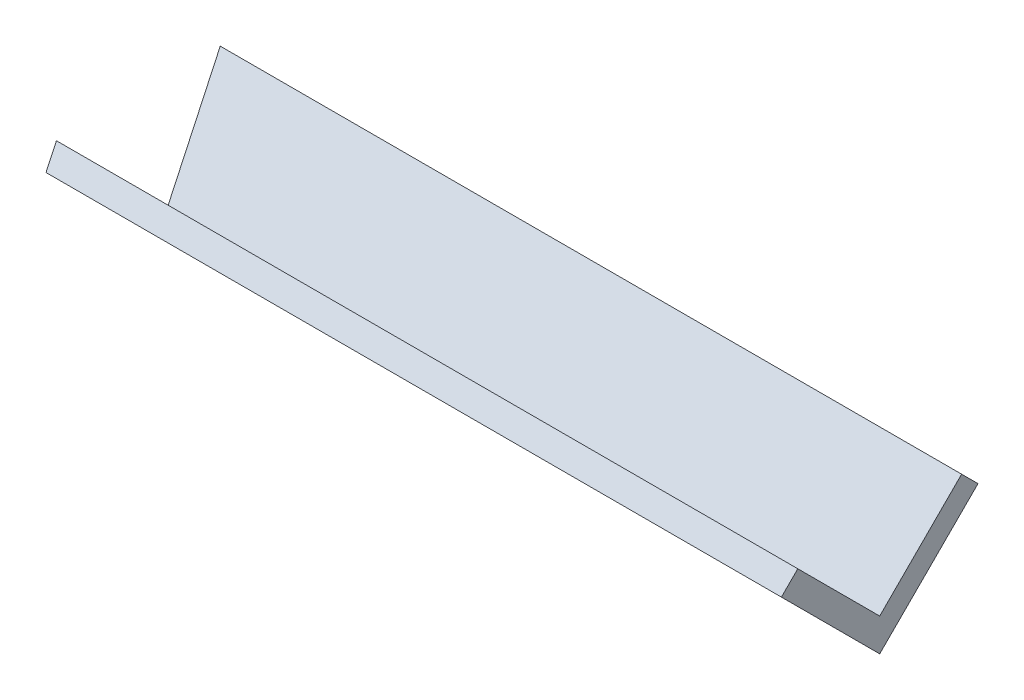
ISO-10303-21;
HEADER;
FILE_DESCRIPTION(('STEP AP214'),'2;1');
FILE_NAME('part.step','',(''),(''),'','','');
FILE_SCHEMA(('AUTOMOTIVE_DESIGN { 1 0 10303 214 1 1 1 1 }'));
ENDSEC;
DATA;
#1=APPLICATION_CONTEXT('core data for automotive mechanical design processes');
#2=APPLICATION_PROTOCOL_DEFINITION('international standard','automotive_design',2000,#1);
#3=PRODUCT_CONTEXT('',#1,'mechanical');
#4=PRODUCT('Part','Part','',(#3));
#5=PRODUCT_RELATED_PRODUCT_CATEGORY('part','',(#4));
#6=PRODUCT_DEFINITION_FORMATION('','',#4);
#7=PRODUCT_DEFINITION_CONTEXT('part definition',#1,'design');
#8=PRODUCT_DEFINITION('design','',#6,#7);
#9=PRODUCT_DEFINITION_SHAPE('','',#8);
#10=(LENGTH_UNIT() NAMED_UNIT(*) SI_UNIT(.MILLI.,.METRE.));
#11=(NAMED_UNIT(*) PLANE_ANGLE_UNIT() SI_UNIT($,.RADIAN.));
#12=(NAMED_UNIT(*) SI_UNIT($,.STERADIAN.) SOLID_ANGLE_UNIT());
#13=UNCERTAINTY_MEASURE_WITH_UNIT(LENGTH_MEASURE(1.E-05),#10,'distance_accuracy_value','');
#14=(GEOMETRIC_REPRESENTATION_CONTEXT(3) GLOBAL_UNCERTAINTY_ASSIGNED_CONTEXT((#13)) GLOBAL_UNIT_ASSIGNED_CONTEXT((#10,
#11,#12)) REPRESENTATION_CONTEXT('',''));
#15=CARTESIAN_POINT('',(0.,0.,0.));
#16=DIRECTION('',(0.,0.,1.));
#17=DIRECTION('',(1.,0.,0.));
#18=AXIS2_PLACEMENT_3D('',#15,#16,#17);
#19=CARTESIAN_POINT('',(101.6,13.4703841816037,-13.4703841816037));
#20=DIRECTION('',(0.,0.707106781186548,0.707106781186548));
#21=DIRECTION('',(0.,-0.707106781186548,0.707106781186548));
#22=AXIS2_PLACEMENT_3D('',#19,#20,#21);
#23=PLANE('',#22);
#24=DIRECTION('',(-1.,0.,0.));
#25=VECTOR('',#24,1.);
#26=CARTESIAN_POINT('',(101.6,0.,0.));
#27=LINE('',#26,#25);
#28=CARTESIAN_POINT('',(101.6,0.,0.));
#29=VERTEX_POINT('',#28);
#30=CARTESIAN_POINT('',(5.71995536727309,0.,0.));
#31=VERTEX_POINT('',#30);
#32=EDGE_CURVE('E102',#29,#31,#27,.T.);
#33=ORIENTED_EDGE('',*,*,#32,.T.);
#34=DIRECTION('',(-0.249243569363955,0.684791078771736,-0.684791078771736));
#35=VECTOR('',#34,1.);
#36=CARTESIAN_POINT('',(7.07800549487229,-3.73121206006632,3.73121206006632));
#37=LINE('',#36,#35);
#38=CARTESIAN_POINT('',(0.817136481039002,13.4703841816037,-13.4703841816037));
#39=VERTEX_POINT('',#38);
#40=EDGE_CURVE('E46',#31,#39,#37,.T.);
#41=ORIENTED_EDGE('',*,*,#40,.T.);
#42=DIRECTION('',(-1.,0.,0.));
#43=VECTOR('',#42,1.);
#44=CARTESIAN_POINT('',(101.6,13.4703841816037,-13.4703841816037));
#45=LINE('',#44,#43);
#46=CARTESIAN_POINT('',(101.6,13.4703841816037,-13.4703841816037));
#47=VERTEX_POINT('',#46);
#48=EDGE_CURVE('E11',#47,#39,#45,.T.);
#49=ORIENTED_EDGE('',*,*,#48,.F.);
#50=DIRECTION('',(0.,0.707106781186548,-0.707106781186548));
#51=VECTOR('',#50,1.);
#52=CARTESIAN_POINT('',(101.6,13.4703841816037,-13.4703841816037));
#53=LINE('',#52,#51);
#54=EDGE_CURVE('E126',#29,#47,#53,.T.);
#55=ORIENTED_EDGE('',*,*,#54,.F.);
#56=EDGE_LOOP('',(#33,#41,#49,#55));
#57=FACE_BOUND('',#56,.T.);
#58=ADVANCED_FACE('F32',(#57),#23,.F.);
#59=CARTESIAN_POINT('',(101.6,15.715448211871,-11.2253201513364));
#60=DIRECTION('',(0.,-0.707106781186547,0.707106781186548));
#61=DIRECTION('',(0.,-0.707106781186548,-0.707106781186547));
#62=AXIS2_PLACEMENT_3D('',#59,#60,#61);
#63=PLANE('',#62);
#64=ORIENTED_EDGE('',*,*,#48,.T.);
#65=DIRECTION('',(-0.249243569363955,0.684791078771736,0.684791078771735));
#66=VECTOR('',#65,1.);
#67=CARTESIAN_POINT('',(6.3116314579193,-1.62561669868172,-28.5663850618891));
#68=LINE('',#67,#66);
#69=CARTESIAN_POINT('',(0.,15.715448211871,-11.2253201513364));
#70=VERTEX_POINT('',#69);
#71=EDGE_CURVE('E123',#39,#70,#68,.T.);
#72=ORIENTED_EDGE('',*,*,#71,.T.);
#73=DIRECTION('',(-1.,0.,0.));
#74=VECTOR('',#73,1.);
#75=CARTESIAN_POINT('',(101.6,15.715448211871,-11.2253201513364));
#76=LINE('',#75,#74);
#77=CARTESIAN_POINT('',(101.6,15.715448211871,-11.2253201513364));
#78=VERTEX_POINT('',#77);
#79=EDGE_CURVE('E39',#78,#70,#76,.T.);
#80=ORIENTED_EDGE('',*,*,#79,.F.);
#81=DIRECTION('',(0.,0.707106781186548,0.707106781186547));
#82=VECTOR('',#81,1.);
#83=CARTESIAN_POINT('',(101.6,15.715448211871,-11.2253201513364));
#84=LINE('',#83,#82);
#85=EDGE_CURVE('E122',#47,#78,#84,.T.);
#86=ORIENTED_EDGE('',*,*,#85,.F.);
#87=EDGE_LOOP('',(#64,#72,#80,#86));
#88=FACE_BOUND('',#87,.T.);
#89=ADVANCED_FACE('F121',(#88),#63,.F.);
#90=CARTESIAN_POINT('',(101.6,4.49012806053458,0.));
#91=DIRECTION('',(0.,-0.707106781186547,-0.707106781186548));
#92=DIRECTION('',(0.,0.707106781186548,-0.707106781186547));
#93=AXIS2_PLACEMENT_3D('',#90,#91,#92);
#94=PLANE('',#93);
#95=ORIENTED_EDGE('',*,*,#79,.T.);
#96=DIRECTION('',(0.249243569363955,-0.684791078771736,0.684791078771736));
#97=VECTOR('',#96,1.);
#98=CARTESIAN_POINT('',(10.1435016426843,-12.1535935056048,16.6437215661394));
#99=LINE('',#98,#97);
#100=CARTESIAN_POINT('',(4.08568240519503,4.49012806053458,0.));
#101=VERTEX_POINT('',#100);
#102=EDGE_CURVE('E117',#70,#101,#99,.T.);
#103=ORIENTED_EDGE('',*,*,#102,.T.);
#104=DIRECTION('',(-1.,0.,0.));
#105=VECTOR('',#104,1.);
#106=CARTESIAN_POINT('',(101.6,4.49012806053458,0.));
#107=LINE('',#106,#105);
#108=CARTESIAN_POINT('',(101.6,4.49012806053458,0.));
#109=VERTEX_POINT('',#108);
#110=EDGE_CURVE('E104',#109,#101,#107,.T.);
#111=ORIENTED_EDGE('',*,*,#110,.F.);
#112=DIRECTION('',(0.,-0.707106781186548,0.707106781186547));
#113=VECTOR('',#112,1.);
#114=CARTESIAN_POINT('',(101.6,4.49012806053458,0.));
#115=LINE('',#114,#113);
#116=EDGE_CURVE('E118',#78,#109,#115,.T.);
#117=ORIENTED_EDGE('',*,*,#116,.F.);
#118=EDGE_LOOP('',(#95,#103,#111,#117));
#119=FACE_BOUND('',#118,.T.);
#120=ADVANCED_FACE('F115',(#119),#94,.F.);
#121=CARTESIAN_POINT('',(101.6,15.715448211871,11.2253201513364));
#122=DIRECTION('',(0.,-0.707106781186548,0.707106781186548));
#123=DIRECTION('',(0.,-0.707106781186547,-0.707106781186548));
#124=AXIS2_PLACEMENT_3D('',#121,#122,#123);
#125=PLANE('',#124);
#126=ORIENTED_EDGE('',*,*,#110,.T.);
#127=DIRECTION('',(-0.249243569363955,0.684791078771736,0.684791078771736));
#128=VECTOR('',#127,1.);
#129=CARTESIAN_POINT('',(6.31163145791928,-1.62561669868169,-6.11574475921627));
#130=LINE('',#129,#128);
#131=CARTESIAN_POINT('',(0.,15.715448211871,11.2253201513364));
#132=VERTEX_POINT('',#131);
#133=EDGE_CURVE('E99',#101,#132,#130,.T.);
#134=ORIENTED_EDGE('',*,*,#133,.T.);
#135=DIRECTION('',(-1.,0.,0.));
#136=VECTOR('',#135,1.);
#137=CARTESIAN_POINT('',(101.6,15.715448211871,11.2253201513364));
#138=LINE('',#137,#136);
#139=CARTESIAN_POINT('',(101.6,15.715448211871,11.2253201513364));
#140=VERTEX_POINT('',#139);
#141=EDGE_CURVE('E98',#140,#132,#138,.T.);
#142=ORIENTED_EDGE('',*,*,#141,.F.);
#143=DIRECTION('',(0.,0.707106781186547,0.707106781186547));
#144=VECTOR('',#143,1.);
#145=CARTESIAN_POINT('',(101.6,15.715448211871,11.2253201513364));
#146=LINE('',#145,#144);
#147=EDGE_CURVE('E134',#109,#140,#146,.T.);
#148=ORIENTED_EDGE('',*,*,#147,.F.);
#149=EDGE_LOOP('',(#126,#134,#142,#148));
#150=FACE_BOUND('',#149,.T.);
#151=ADVANCED_FACE('F140',(#150),#125,.F.);
#152=CARTESIAN_POINT('',(101.6,13.4703841816037,13.4703841816037));
#153=DIRECTION('',(0.,-0.707106781186546,-0.707106781186548));
#154=DIRECTION('',(0.,0.707106781186549,-0.707106781186547));
#155=AXIS2_PLACEMENT_3D('',#152,#153,#154);
#156=PLANE('',#155);
#157=ORIENTED_EDGE('',*,*,#141,.T.);
#158=DIRECTION('',(0.249243569363955,-0.684791078771737,0.684791078771735));
#159=VECTOR('',#158,1.);
#160=CARTESIAN_POINT('',(7.07800549487232,-3.73121206006636,30.6719804232738));
#161=LINE('',#160,#159);
#162=CARTESIAN_POINT('',(0.817136481039021,13.4703841816037,13.4703841816037));
#163=VERTEX_POINT('',#162);
#164=EDGE_CURVE('E85',#132,#163,#161,.T.);
#165=ORIENTED_EDGE('',*,*,#164,.T.);
#166=DIRECTION('',(-1.,0.,0.));
#167=VECTOR('',#166,1.);
#168=CARTESIAN_POINT('',(101.6,13.4703841816037,13.4703841816037));
#169=LINE('',#168,#167);
#170=CARTESIAN_POINT('',(101.6,13.4703841816037,13.4703841816037));
#171=VERTEX_POINT('',#170);
#172=EDGE_CURVE('E96',#171,#163,#169,.T.);
#173=ORIENTED_EDGE('',*,*,#172,.F.);
#174=DIRECTION('',(0.,-0.707106781186549,0.707106781186546));
#175=VECTOR('',#174,1.);
#176=CARTESIAN_POINT('',(101.6,13.4703841816037,13.4703841816037));
#177=LINE('',#176,#175);
#178=EDGE_CURVE('E136',#140,#171,#177,.T.);
#179=ORIENTED_EDGE('',*,*,#178,.F.);
#180=EDGE_LOOP('',(#157,#165,#173,#179));
#181=FACE_BOUND('',#180,.T.);
#182=ADVANCED_FACE('F94',(#181),#156,.F.);
#183=CARTESIAN_POINT('',(101.6,0.,0.));
#184=DIRECTION('',(0.,0.707106781186547,-0.707106781186548));
#185=DIRECTION('',(0.,0.707106781186548,0.707106781186547));
#186=AXIS2_PLACEMENT_3D('',#183,#184,#185);
#187=PLANE('',#186);
#188=ORIENTED_EDGE('',*,*,#172,.T.);
#189=DIRECTION('',(0.249243569363955,-0.684791078771736,-0.684791078771736));
#190=VECTOR('',#189,1.);
#191=CARTESIAN_POINT('',(11.6762497165903,-16.3647842283741,-16.3647842283741));
#192=LINE('',#191,#190);
#193=EDGE_CURVE('E82',#163,#31,#192,.T.);
#194=ORIENTED_EDGE('',*,*,#193,.T.);
#195=ORIENTED_EDGE('',*,*,#32,.F.);
#196=DIRECTION('',(0.,-0.707106781186548,-0.707106781186547));
#197=VECTOR('',#196,1.);
#198=CARTESIAN_POINT('',(101.6,0.,0.));
#199=LINE('',#198,#197);
#200=EDGE_CURVE('E54',#171,#29,#199,.T.);
#201=ORIENTED_EDGE('',*,*,#200,.F.);
#202=EDGE_LOOP('',(#188,#194,#195,#201));
#203=FACE_BOUND('',#202,.T.);
#204=ADVANCED_FACE('F101',(#203),#187,.F.);
#205=CARTESIAN_POINT('',(101.6,0.,0.));
#206=DIRECTION('',(-1.,0.,0.));
#207=DIRECTION('',(0.,0.,1.));
#208=AXIS2_PLACEMENT_3D('',#205,#206,#207);
#209=PLANE('',#208);
#210=ORIENTED_EDGE('',*,*,#54,.T.);
#211=ORIENTED_EDGE('',*,*,#85,.T.);
#212=ORIENTED_EDGE('',*,*,#116,.T.);
#213=ORIENTED_EDGE('',*,*,#147,.T.);
#214=ORIENTED_EDGE('',*,*,#178,.T.);
#215=ORIENTED_EDGE('',*,*,#200,.T.);
#216=EDGE_LOOP('',(#210,#211,#212,#213,#214,#215));
#217=FACE_BOUND('',#216,.T.);
#218=ADVANCED_FACE('F137',(#217),#209,.F.);
#219=CARTESIAN_POINT('',(5.05084769563059,1.83835821902158,0.));
#220=DIRECTION('',(0.939692620785908,0.342020143325669,0.));
#221=DIRECTION('',(-0.342020143325669,0.939692620785908,0.));
#222=AXIS2_PLACEMENT_3D('',#219,#220,#221);
#223=PLANE('',#222);
#224=ORIENTED_EDGE('',*,*,#193,.F.);
#225=ORIENTED_EDGE('',*,*,#164,.F.);
#226=ORIENTED_EDGE('',*,*,#133,.F.);
#227=ORIENTED_EDGE('',*,*,#102,.F.);
#228=ORIENTED_EDGE('',*,*,#71,.F.);
#229=ORIENTED_EDGE('',*,*,#40,.F.);
#230=EDGE_LOOP('',(#224,#225,#226,#227,#228,#229));
#231=FACE_BOUND('',#230,.T.);
#232=ADVANCED_FACE('F84',(#231),#223,.F.);
#233=CLOSED_SHELL('',(#58,#89,#120,#151,#182,#204,#218,#232));
#234=MANIFOLD_SOLID_BREP('B2',#233);
#235=ADVANCED_BREP_SHAPE_REPRESENTATION('',(#18,#234),#14);
#236=SHAPE_DEFINITION_REPRESENTATION(#9,#235);
ENDSEC;
END-ISO-10303-21;
